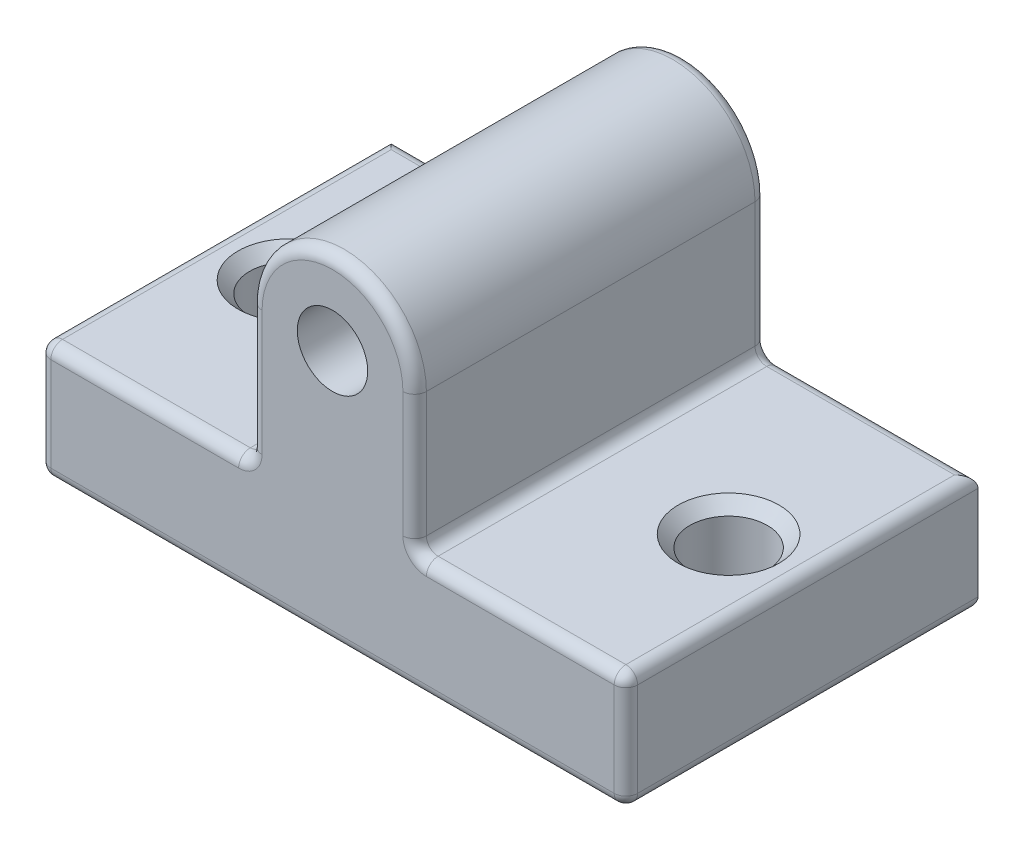
ISO-10303-21;
HEADER;
FILE_DESCRIPTION(('STEP AP214'),'2;1');
FILE_NAME('part.step','',(''),(''),'','','');
FILE_SCHEMA(('AUTOMOTIVE_DESIGN { 1 0 10303 214 1 1 1 1 }'));
ENDSEC;
DATA;
#1=APPLICATION_CONTEXT('core data for automotive mechanical design processes');
#2=APPLICATION_PROTOCOL_DEFINITION('international standard','automotive_design',2000,#1);
#3=PRODUCT_CONTEXT('',#1,'mechanical');
#4=PRODUCT('Part','Part','',(#3));
#5=PRODUCT_RELATED_PRODUCT_CATEGORY('part','',(#4));
#6=PRODUCT_DEFINITION_FORMATION('','',#4);
#7=PRODUCT_DEFINITION_CONTEXT('part definition',#1,'design');
#8=PRODUCT_DEFINITION('design','',#6,#7);
#9=PRODUCT_DEFINITION_SHAPE('','',#8);
#10=(LENGTH_UNIT() NAMED_UNIT(*) SI_UNIT(.MILLI.,.METRE.));
#11=(NAMED_UNIT(*) PLANE_ANGLE_UNIT() SI_UNIT($,.RADIAN.));
#12=(NAMED_UNIT(*) SI_UNIT($,.STERADIAN.) SOLID_ANGLE_UNIT());
#13=UNCERTAINTY_MEASURE_WITH_UNIT(LENGTH_MEASURE(1.E-05),#10,'distance_accuracy_value','');
#14=(GEOMETRIC_REPRESENTATION_CONTEXT(3) GLOBAL_UNCERTAINTY_ASSIGNED_CONTEXT((#13)) GLOBAL_UNIT_ASSIGNED_CONTEXT((#10,
#11,#12)) REPRESENTATION_CONTEXT('',''));
#15=CARTESIAN_POINT('',(0.,0.,0.));
#16=DIRECTION('',(0.,0.,1.));
#17=DIRECTION('',(1.,0.,0.));
#18=AXIS2_PLACEMENT_3D('',#15,#16,#17);
#19=CARTESIAN_POINT('',(25.,5.,30.));
#20=DIRECTION('',(0.,-1.,0.));
#21=DIRECTION('',(1.,0.,0.));
#22=AXIS2_PLACEMENT_3D('',#19,#20,#21);
#23=PLANE('',#22);
#24=CARTESIAN_POINT('',(-18.75,5.,15.));
#25=DIRECTION('',(0.,-1.,0.));
#26=DIRECTION('',(1.,0.,0.));
#27=AXIS2_PLACEMENT_3D('',#24,#25,#26);
#28=CIRCLE('',#27,4.3);
#29=CARTESIAN_POINT('',(-14.45,5.,15.));
#30=VERTEX_POINT('',#29);
#31=EDGE_CURVE('E403',#30,#30,#28,.T.);
#32=ORIENTED_EDGE('',*,*,#31,.T.);
#33=EDGE_LOOP('',(#32));
#34=FACE_BOUND('',#33,.T.);
#35=DIRECTION('',(-1.,0.,0.));
#36=VECTOR('',#35,1.);
#37=CARTESIAN_POINT('',(25.,5.,1.));
#38=LINE('',#37,#36);
#39=CARTESIAN_POINT('',(-8.,5.,1.));
#40=VERTEX_POINT('',#39);
#41=CARTESIAN_POINT('',(-24.,5.,1.));
#42=VERTEX_POINT('',#41);
#43=EDGE_CURVE('E57',#40,#42,#38,.T.);
#44=ORIENTED_EDGE('',*,*,#43,.T.);
#45=DIRECTION('',(0.,0.,-1.));
#46=VECTOR('',#45,1.);
#47=CARTESIAN_POINT('',(-24.,5.,30.));
#48=LINE('',#47,#46);
#49=CARTESIAN_POINT('',(-24.,5.,29.));
#50=VERTEX_POINT('',#49);
#51=EDGE_CURVE('E217',#42,#50,#48,.F.);
#52=ORIENTED_EDGE('',*,*,#51,.T.);
#53=DIRECTION('',(-1.,0.,0.));
#54=VECTOR('',#53,1.);
#55=CARTESIAN_POINT('',(-7.,5.,29.));
#56=LINE('',#55,#54);
#57=CARTESIAN_POINT('',(-8.,5.,29.));
#58=VERTEX_POINT('',#57);
#59=EDGE_CURVE('E309',#50,#58,#56,.F.);
#60=ORIENTED_EDGE('',*,*,#59,.T.);
#61=DIRECTION('',(0.,0.,1.));
#62=VECTOR('',#61,1.);
#63=CARTESIAN_POINT('',(-8.,5.,30.));
#64=LINE('',#63,#62);
#65=EDGE_CURVE('E62',#58,#40,#64,.F.);
#66=ORIENTED_EDGE('',*,*,#65,.T.);
#67=EDGE_LOOP('',(#44,#52,#60,#66));
#68=FACE_BOUND('',#67,.T.);
#69=ADVANCED_FACE('F41',(#34,#68),#23,.F.);
#70=CARTESIAN_POINT('',(-25.,-5.,30.));
#71=DIRECTION('',(1.,0.,0.));
#72=DIRECTION('',(0.,0.,-1.));
#73=AXIS2_PLACEMENT_3D('',#70,#71,#72);
#74=PLANE('',#73);
#75=DIRECTION('',(0.,-1.,0.));
#76=VECTOR('',#75,1.);
#77=CARTESIAN_POINT('',(-25.,-5.,0.));
#78=LINE('',#77,#76);
#79=CARTESIAN_POINT('',(-25.,4.,0.));
#80=VERTEX_POINT('',#79);
#81=CARTESIAN_POINT('',(-25.,-4.,0.));
#82=VERTEX_POINT('',#81);
#83=EDGE_CURVE('E193',#80,#82,#78,.T.);
#84=ORIENTED_EDGE('',*,*,#83,.T.);
#85=DIRECTION('',(0.,0.,-1.));
#86=VECTOR('',#85,1.);
#87=CARTESIAN_POINT('',(-25.,-4.,30.));
#88=LINE('',#87,#86);
#89=CARTESIAN_POINT('',(-25.,-4.,29.));
#90=VERTEX_POINT('',#89);
#91=EDGE_CURVE('E289',#82,#90,#88,.F.);
#92=ORIENTED_EDGE('',*,*,#91,.T.);
#93=DIRECTION('',(0.,-1.,0.));
#94=VECTOR('',#93,1.);
#95=CARTESIAN_POINT('',(-25.,5.,29.));
#96=LINE('',#95,#94);
#97=CARTESIAN_POINT('',(-25.,4.,29.));
#98=VERTEX_POINT('',#97);
#99=EDGE_CURVE('E196',#90,#98,#96,.F.);
#100=ORIENTED_EDGE('',*,*,#99,.T.);
#101=DIRECTION('',(0.,0.,-1.));
#102=VECTOR('',#101,1.);
#103=CARTESIAN_POINT('',(-25.,4.,30.));
#104=LINE('',#103,#102);
#105=EDGE_CURVE('E190',#98,#80,#104,.T.);
#106=ORIENTED_EDGE('',*,*,#105,.T.);
#107=EDGE_LOOP('',(#84,#92,#100,#106));
#108=FACE_BOUND('',#107,.T.);
#109=ADVANCED_FACE('F192',(#108),#74,.F.);
#110=CARTESIAN_POINT('',(25.,-5.,30.));
#111=DIRECTION('',(0.,1.,0.));
#112=DIRECTION('',(-1.,0.,0.));
#113=AXIS2_PLACEMENT_3D('',#110,#111,#112);
#114=PLANE('',#113);
#115=DIRECTION('',(0.,0.,-1.));
#116=VECTOR('',#115,1.);
#117=CARTESIAN_POINT('',(-24.,-5.,30.));
#118=LINE('',#117,#116);
#119=CARTESIAN_POINT('',(-24.,-5.,29.));
#120=VERTEX_POINT('',#119);
#121=CARTESIAN_POINT('',(-24.,-5.,1.));
#122=VERTEX_POINT('',#121);
#123=EDGE_CURVE('E295',#120,#122,#118,.T.);
#124=ORIENTED_EDGE('',*,*,#123,.T.);
#125=DIRECTION('',(1.,0.,0.));
#126=VECTOR('',#125,1.);
#127=CARTESIAN_POINT('',(25.,-5.,1.));
#128=LINE('',#127,#126);
#129=CARTESIAN_POINT('',(24.,-5.,1.));
#130=VERTEX_POINT('',#129);
#131=EDGE_CURVE('E298',#122,#130,#128,.T.);
#132=ORIENTED_EDGE('',*,*,#131,.T.);
#133=DIRECTION('',(0.,0.,-1.));
#134=VECTOR('',#133,1.);
#135=CARTESIAN_POINT('',(24.,-5.,30.));
#136=LINE('',#135,#134);
#137=CARTESIAN_POINT('',(24.,-5.,29.));
#138=VERTEX_POINT('',#137);
#139=EDGE_CURVE('E293',#130,#138,#136,.F.);
#140=ORIENTED_EDGE('',*,*,#139,.T.);
#141=DIRECTION('',(1.,0.,0.));
#142=VECTOR('',#141,1.);
#143=CARTESIAN_POINT('',(-25.,-5.,29.));
#144=LINE('',#143,#142);
#145=EDGE_CURVE('E291',#138,#120,#144,.F.);
#146=ORIENTED_EDGE('',*,*,#145,.T.);
#147=EDGE_LOOP('',(#124,#132,#140,#146));
#148=FACE_BOUND('',#147,.T.);
#149=CARTESIAN_POINT('',(-18.75,-5.,15.));
#150=DIRECTION('',(0.,1.,0.));
#151=DIRECTION('',(-1.,0.,0.));
#152=AXIS2_PLACEMENT_3D('',#149,#150,#151);
#153=CIRCLE('',#152,3.3);
#154=CARTESIAN_POINT('',(-22.05,-5.,15.));
#155=VERTEX_POINT('',#154);
#156=EDGE_CURVE('E528',#155,#155,#153,.F.);
#157=ORIENTED_EDGE('',*,*,#156,.F.);
#158=EDGE_LOOP('',(#157));
#159=FACE_BOUND('',#158,.T.);
#160=CARTESIAN_POINT('',(18.75,-5.,15.));
#161=DIRECTION('',(0.,1.,0.));
#162=DIRECTION('',(-1.,0.,0.));
#163=AXIS2_PLACEMENT_3D('',#160,#161,#162);
#164=CIRCLE('',#163,3.3);
#165=CARTESIAN_POINT('',(15.45,-5.,15.));
#166=VERTEX_POINT('',#165);
#167=EDGE_CURVE('E400',#166,#166,#164,.F.);
#168=ORIENTED_EDGE('',*,*,#167,.F.);
#169=EDGE_LOOP('',(#168));
#170=FACE_BOUND('',#169,.T.);
#171=ADVANCED_FACE('F429',(#148,#159,#170),#114,.F.);
#172=CARTESIAN_POINT('',(25.,-5.,30.));
#173=DIRECTION('',(-1.,0.,0.));
#174=DIRECTION('',(0.,0.,1.));
#175=AXIS2_PLACEMENT_3D('',#172,#173,#174);
#176=PLANE('',#175);
#177=DIRECTION('',(0.,1.,0.));
#178=VECTOR('',#177,1.);
#179=CARTESIAN_POINT('',(25.,-5.,29.));
#180=LINE('',#179,#178);
#181=CARTESIAN_POINT('',(25.,4.,29.));
#182=VERTEX_POINT('',#181);
#183=CARTESIAN_POINT('',(25.,-4.,29.));
#184=VERTEX_POINT('',#183);
#185=EDGE_CURVE('E285',#182,#184,#180,.F.);
#186=ORIENTED_EDGE('',*,*,#185,.T.);
#187=DIRECTION('',(0.,0.,-1.));
#188=VECTOR('',#187,1.);
#189=CARTESIAN_POINT('',(25.,-4.,30.));
#190=LINE('',#189,#188);
#191=CARTESIAN_POINT('',(25.,-4.,0.));
#192=VERTEX_POINT('',#191);
#193=EDGE_CURVE('E200',#184,#192,#190,.T.);
#194=ORIENTED_EDGE('',*,*,#193,.T.);
#195=DIRECTION('',(0.,1.,0.));
#196=VECTOR('',#195,1.);
#197=CARTESIAN_POINT('',(25.,-5.,0.));
#198=LINE('',#197,#196);
#199=CARTESIAN_POINT('',(25.,4.,0.));
#200=VERTEX_POINT('',#199);
#201=EDGE_CURVE('E211',#192,#200,#198,.T.);
#202=ORIENTED_EDGE('',*,*,#201,.T.);
#203=DIRECTION('',(0.,0.,-1.));
#204=VECTOR('',#203,1.);
#205=CARTESIAN_POINT('',(25.,4.,30.));
#206=LINE('',#205,#204);
#207=EDGE_CURVE('E283',#200,#182,#206,.F.);
#208=ORIENTED_EDGE('',*,*,#207,.T.);
#209=EDGE_LOOP('',(#186,#194,#202,#208));
#210=FACE_BOUND('',#209,.T.);
#211=ADVANCED_FACE('F434',(#210),#176,.F.);
#212=CARTESIAN_POINT('',(18.75,5.,15.));
#213=DIRECTION('',(0.,-1.,0.));
#214=DIRECTION('',(1.,0.,0.));
#215=AXIS2_PLACEMENT_3D('',#212,#213,#214);
#216=CIRCLE('',#215,4.3);
#217=CARTESIAN_POINT('',(23.05,5.,15.));
#218=VERTEX_POINT('',#217);
#219=EDGE_CURVE('E11',#218,#218,#216,.T.);
#220=ORIENTED_EDGE('',*,*,#219,.T.);
#221=EDGE_LOOP('',(#220));
#222=FACE_BOUND('',#221,.T.);
#223=DIRECTION('',(0.,0.,-1.));
#224=VECTOR('',#223,1.);
#225=CARTESIAN_POINT('',(24.,5.,30.));
#226=LINE('',#225,#224);
#227=CARTESIAN_POINT('',(24.,5.,29.));
#228=VERTEX_POINT('',#227);
#229=CARTESIAN_POINT('',(24.,5.,1.));
#230=VERTEX_POINT('',#229);
#231=EDGE_CURVE('E304',#228,#230,#226,.T.);
#232=ORIENTED_EDGE('',*,*,#231,.T.);
#233=DIRECTION('',(-1.,0.,0.));
#234=VECTOR('',#233,1.);
#235=CARTESIAN_POINT('',(25.,5.,1.));
#236=LINE('',#235,#234);
#237=CARTESIAN_POINT('',(8.,5.,1.));
#238=VERTEX_POINT('',#237);
#239=EDGE_CURVE('E307',#230,#238,#236,.T.);
#240=ORIENTED_EDGE('',*,*,#239,.T.);
#241=DIRECTION('',(0.,0.,1.));
#242=VECTOR('',#241,1.);
#243=CARTESIAN_POINT('',(8.,5.,30.));
#244=LINE('',#243,#242);
#245=CARTESIAN_POINT('',(8.,5.,29.));
#246=VERTEX_POINT('',#245);
#247=EDGE_CURVE('E302',#238,#246,#244,.T.);
#248=ORIENTED_EDGE('',*,*,#247,.T.);
#249=DIRECTION('',(-1.,0.,0.));
#250=VECTOR('',#249,1.);
#251=CARTESIAN_POINT('',(25.,5.,29.));
#252=LINE('',#251,#250);
#253=EDGE_CURVE('E300',#246,#228,#252,.F.);
#254=ORIENTED_EDGE('',*,*,#253,.T.);
#255=EDGE_LOOP('',(#232,#240,#248,#254));
#256=FACE_BOUND('',#255,.T.);
#257=ADVANCED_FACE('F423',(#222,#256),#23,.F.);
#258=CARTESIAN_POINT('',(0.,0.,30.));
#259=DIRECTION('',(0.,0.,1.));
#260=DIRECTION('',(1.,0.,0.));
#261=AXIS2_PLACEMENT_3D('',#258,#259,#260);
#262=PLANE('',#261);
#263=DIRECTION('',(-1.,0.,0.));
#264=VECTOR('',#263,1.);
#265=CARTESIAN_POINT('',(-25.,4.,30.));
#266=LINE('',#265,#264);
#267=CARTESIAN_POINT('',(-8.,4.,30.));
#268=VERTEX_POINT('',#267);
#269=CARTESIAN_POINT('',(-24.,4.,30.));
#270=VERTEX_POINT('',#269);
#271=EDGE_CURVE('E277',#268,#270,#266,.T.);
#272=ORIENTED_EDGE('',*,*,#271,.T.);
#273=DIRECTION('',(0.,-1.,0.));
#274=VECTOR('',#273,1.);
#275=CARTESIAN_POINT('',(-24.,-5.,30.));
#276=LINE('',#275,#274);
#277=CARTESIAN_POINT('',(-24.,-4.,30.));
#278=VERTEX_POINT('',#277);
#279=EDGE_CURVE('E281',#270,#278,#276,.T.);
#280=ORIENTED_EDGE('',*,*,#279,.T.);
#281=DIRECTION('',(1.,0.,0.));
#282=VECTOR('',#281,1.);
#283=CARTESIAN_POINT('',(25.,-4.,30.));
#284=LINE('',#283,#282);
#285=CARTESIAN_POINT('',(24.,-4.,30.));
#286=VERTEX_POINT('',#285);
#287=EDGE_CURVE('E279',#278,#286,#284,.T.);
#288=ORIENTED_EDGE('',*,*,#287,.T.);
#289=DIRECTION('',(0.,1.,0.));
#290=VECTOR('',#289,1.);
#291=CARTESIAN_POINT('',(24.,5.,30.));
#292=LINE('',#291,#290);
#293=CARTESIAN_POINT('',(24.,4.,30.));
#294=VERTEX_POINT('',#293);
#295=EDGE_CURVE('E273',#286,#294,#292,.T.);
#296=ORIENTED_EDGE('',*,*,#295,.T.);
#297=DIRECTION('',(-1.,0.,0.));
#298=VECTOR('',#297,1.);
#299=CARTESIAN_POINT('',(7.,4.,30.));
#300=LINE('',#299,#298);
#301=CARTESIAN_POINT('',(8.,4.,30.));
#302=VERTEX_POINT('',#301);
#303=EDGE_CURVE('E271',#294,#302,#300,.T.);
#304=ORIENTED_EDGE('',*,*,#303,.T.);
#305=CARTESIAN_POINT('',(8.,6.,30.));
#306=DIRECTION('',(0.,0.,1.));
#307=DIRECTION('',(1.,0.,0.));
#308=AXIS2_PLACEMENT_3D('',#305,#306,#307);
#309=CIRCLE('',#308,2.);
#310=CARTESIAN_POINT('',(6.,6.,30.));
#311=VERTEX_POINT('',#310);
#312=EDGE_CURVE('E268',#311,#302,#309,.T.);
#313=ORIENTED_EDGE('',*,*,#312,.F.);
#314=DIRECTION('',(0.,1.,0.));
#315=VECTOR('',#314,1.);
#316=CARTESIAN_POINT('',(6.,0.,30.));
#317=LINE('',#316,#315);
#318=CARTESIAN_POINT('',(6.,16.65178901,30.));
#319=VERTEX_POINT('',#318);
#320=EDGE_CURVE('E263',#311,#319,#317,.T.);
#321=ORIENTED_EDGE('',*,*,#320,.T.);
#322=CARTESIAN_POINT('',(0.,16.65178901,30.));
#323=DIRECTION('',(0.,0.,1.));
#324=DIRECTION('',(1.,0.,0.));
#325=AXIS2_PLACEMENT_3D('',#322,#323,#324);
#326=CIRCLE('',#325,6.);
#327=CARTESIAN_POINT('',(-6.,16.65178901,30.));
#328=VERTEX_POINT('',#327);
#329=EDGE_CURVE('E261',#319,#328,#326,.T.);
#330=ORIENTED_EDGE('',*,*,#329,.T.);
#331=DIRECTION('',(0.,-1.,0.));
#332=VECTOR('',#331,1.);
#333=CARTESIAN_POINT('',(-6.,0.,30.));
#334=LINE('',#333,#332);
#335=CARTESIAN_POINT('',(-6.,6.,30.));
#336=VERTEX_POINT('',#335);
#337=EDGE_CURVE('E265',#328,#336,#334,.T.);
#338=ORIENTED_EDGE('',*,*,#337,.T.);
#339=CARTESIAN_POINT('',(-8.,6.,30.));
#340=DIRECTION('',(0.,0.,1.));
#341=DIRECTION('',(1.,0.,0.));
#342=AXIS2_PLACEMENT_3D('',#339,#340,#341);
#343=CIRCLE('',#342,2.);
#344=EDGE_CURVE('E275',#268,#336,#343,.T.);
#345=ORIENTED_EDGE('',*,*,#344,.F.);
#346=EDGE_LOOP('',(#272,#280,#288,#296,#304,#313,#321,#330,#338,#345));
#347=FACE_BOUND('',#346,.T.);
#348=CARTESIAN_POINT('',(0.,16.65178901,30.));
#349=DIRECTION('',(0.,0.,1.));
#350=DIRECTION('',(1.,0.,0.));
#351=AXIS2_PLACEMENT_3D('',#348,#349,#350);
#352=CIRCLE('',#351,3.);
#353=CARTESIAN_POINT('',(3.,16.65178901,30.));
#354=VERTEX_POINT('',#353);
#355=EDGE_CURVE('E523',#354,#354,#352,.T.);
#356=ORIENTED_EDGE('',*,*,#355,.F.);
#357=EDGE_LOOP('',(#356));
#358=FACE_BOUND('',#357,.T.);
#359=ADVANCED_FACE('F433',(#347,#358),#262,.T.);
#360=CARTESIAN_POINT('',(0.,0.,0.));
#361=DIRECTION('',(0.,0.,1.));
#362=DIRECTION('',(1.,0.,0.));
#363=AXIS2_PLACEMENT_3D('',#360,#361,#362);
#364=PLANE('',#363);
#365=ORIENTED_EDGE('',*,*,#201,.F.);
#366=DIRECTION('',(1.,0.,0.));
#367=VECTOR('',#366,1.);
#368=CARTESIAN_POINT('',(0.,-4.,0.));
#369=LINE('',#368,#367);
#370=EDGE_CURVE('E210',#192,#82,#369,.F.);
#371=ORIENTED_EDGE('',*,*,#370,.T.);
#372=ORIENTED_EDGE('',*,*,#83,.F.);
#373=DIRECTION('',(-1.,0.,0.));
#374=VECTOR('',#373,1.);
#375=CARTESIAN_POINT('',(0.,4.,0.));
#376=LINE('',#375,#374);
#377=CARTESIAN_POINT('',(-8.,4.,0.));
#378=VERTEX_POINT('',#377);
#379=EDGE_CURVE('E207',#80,#378,#376,.F.);
#380=ORIENTED_EDGE('',*,*,#379,.T.);
#381=CARTESIAN_POINT('',(-8.,6.,0.));
#382=DIRECTION('',(0.,0.,1.));
#383=DIRECTION('',(1.,0.,0.));
#384=AXIS2_PLACEMENT_3D('',#381,#382,#383);
#385=CIRCLE('',#384,2.);
#386=CARTESIAN_POINT('',(-6.,6.,0.));
#387=VERTEX_POINT('',#386);
#388=EDGE_CURVE('E227',#387,#378,#385,.F.);
#389=ORIENTED_EDGE('',*,*,#388,.F.);
#390=DIRECTION('',(0.,1.,0.));
#391=VECTOR('',#390,1.);
#392=CARTESIAN_POINT('',(-6.,16.65178901,0.));
#393=LINE('',#392,#391);
#394=CARTESIAN_POINT('',(-6.,16.65178901,0.));
#395=VERTEX_POINT('',#394);
#396=EDGE_CURVE('E226',#387,#395,#393,.T.);
#397=ORIENTED_EDGE('',*,*,#396,.T.);
#398=CARTESIAN_POINT('',(0.,16.65178901,0.));
#399=DIRECTION('',(0.,0.,1.));
#400=DIRECTION('',(1.,0.,0.));
#401=AXIS2_PLACEMENT_3D('',#398,#399,#400);
#402=CIRCLE('',#401,6.);
#403=CARTESIAN_POINT('',(6.,16.65178901,0.));
#404=VERTEX_POINT('',#403);
#405=EDGE_CURVE('E229',#395,#404,#402,.F.);
#406=ORIENTED_EDGE('',*,*,#405,.T.);
#407=DIRECTION('',(0.,-1.,0.));
#408=VECTOR('',#407,1.);
#409=CARTESIAN_POINT('',(6.,5.,0.));
#410=LINE('',#409,#408);
#411=CARTESIAN_POINT('',(6.,6.,0.));
#412=VERTEX_POINT('',#411);
#413=EDGE_CURVE('E236',#404,#412,#410,.T.);
#414=ORIENTED_EDGE('',*,*,#413,.T.);
#415=CARTESIAN_POINT('',(8.,6.,0.));
#416=DIRECTION('',(0.,0.,1.));
#417=DIRECTION('',(1.,0.,0.));
#418=AXIS2_PLACEMENT_3D('',#415,#416,#417);
#419=CIRCLE('',#418,2.);
#420=CARTESIAN_POINT('',(8.,4.,0.));
#421=VERTEX_POINT('',#420);
#422=EDGE_CURVE('E238',#421,#412,#419,.F.);
#423=ORIENTED_EDGE('',*,*,#422,.F.);
#424=DIRECTION('',(-1.,0.,0.));
#425=VECTOR('',#424,1.);
#426=CARTESIAN_POINT('',(0.,4.,0.));
#427=LINE('',#426,#425);
#428=EDGE_CURVE('E241',#421,#200,#427,.F.);
#429=ORIENTED_EDGE('',*,*,#428,.T.);
#430=EDGE_LOOP('',(#365,#371,#372,#380,#389,#397,#406,#414,#423,#429));
#431=FACE_BOUND('',#430,.T.);
#432=CARTESIAN_POINT('',(0.,16.65178901,0.));
#433=DIRECTION('',(0.,0.,1.));
#434=DIRECTION('',(1.,0.,0.));
#435=AXIS2_PLACEMENT_3D('',#432,#433,#434);
#436=CIRCLE('',#435,3.);
#437=CARTESIAN_POINT('',(3.,16.65178901,0.));
#438=VERTEX_POINT('',#437);
#439=EDGE_CURVE('E212',#438,#438,#436,.F.);
#440=ORIENTED_EDGE('',*,*,#439,.F.);
#441=EDGE_LOOP('',(#440));
#442=FACE_BOUND('',#441,.T.);
#443=ADVANCED_FACE('F204',(#431,#442),#364,.F.);
#444=CARTESIAN_POINT('',(7.,16.65178901,-23.3214329163874));
#445=DIRECTION('',(1.,0.,0.));
#446=DIRECTION('',(0.,1.,0.));
#447=AXIS2_PLACEMENT_3D('',#444,#445,#446);
#448=PLANE('',#447);
#449=DIRECTION('',(0.,0.,1.));
#450=VECTOR('',#449,1.);
#451=CARTESIAN_POINT('',(7.,6.,-23.3214329163874));
#452=LINE('',#451,#450);
#453=CARTESIAN_POINT('',(7.,6.,29.));
#454=VERTEX_POINT('',#453);
#455=CARTESIAN_POINT('',(7.,6.,1.));
#456=VERTEX_POINT('',#455);
#457=EDGE_CURVE('E249',#454,#456,#452,.F.);
#458=ORIENTED_EDGE('',*,*,#457,.T.);
#459=DIRECTION('',(0.,-1.,0.));
#460=VECTOR('',#459,1.);
#461=CARTESIAN_POINT('',(7.,16.65178901,1.));
#462=LINE('',#461,#460);
#463=CARTESIAN_POINT('',(7.,16.65178901,1.));
#464=VERTEX_POINT('',#463);
#465=EDGE_CURVE('E253',#456,#464,#462,.F.);
#466=ORIENTED_EDGE('',*,*,#465,.T.);
#467=DIRECTION('',(0.,0.,1.));
#468=VECTOR('',#467,1.);
#469=CARTESIAN_POINT('',(7.,16.65178901,-23.3214329163874));
#470=LINE('',#469,#468);
#471=CARTESIAN_POINT('',(7.,16.65178901,29.));
#472=VERTEX_POINT('',#471);
#473=EDGE_CURVE('E520',#464,#472,#470,.T.);
#474=ORIENTED_EDGE('',*,*,#473,.T.);
#475=DIRECTION('',(0.,1.,0.));
#476=VECTOR('',#475,1.);
#477=CARTESIAN_POINT('',(7.,16.65178901,29.));
#478=LINE('',#477,#476);
#479=EDGE_CURVE('E251',#472,#454,#478,.F.);
#480=ORIENTED_EDGE('',*,*,#479,.T.);
#481=EDGE_LOOP('',(#458,#466,#474,#480));
#482=FACE_BOUND('',#481,.T.);
#483=ADVANCED_FACE('F560',(#482),#448,.T.);
#484=CARTESIAN_POINT('',(0.,16.65178901,-23.3214329163874));
#485=DIRECTION('',(0.,0.,1.));
#486=DIRECTION('',(1.,0.,0.));
#487=AXIS2_PLACEMENT_3D('',#484,#485,#486);
#488=CYLINDRICAL_SURFACE('',#487,7.);
#489=ORIENTED_EDGE('',*,*,#473,.F.);
#490=CARTESIAN_POINT('',(0.,16.65178901,1.));
#491=DIRECTION('',(0.,0.,1.));
#492=DIRECTION('',(1.,0.,0.));
#493=AXIS2_PLACEMENT_3D('',#490,#491,#492);
#494=CIRCLE('',#493,7.);
#495=CARTESIAN_POINT('',(-7.,16.65178901,1.));
#496=VERTEX_POINT('',#495);
#497=EDGE_CURVE('E246',#464,#496,#494,.T.);
#498=ORIENTED_EDGE('',*,*,#497,.T.);
#499=DIRECTION('',(0.,0.,1.));
#500=VECTOR('',#499,1.);
#501=CARTESIAN_POINT('',(-7.,16.65178901,-23.3214329163874));
#502=LINE('',#501,#500);
#503=CARTESIAN_POINT('',(-7.,16.65178901,29.));
#504=VERTEX_POINT('',#503);
#505=EDGE_CURVE('E519',#496,#504,#502,.T.);
#506=ORIENTED_EDGE('',*,*,#505,.T.);
#507=CARTESIAN_POINT('',(0.,16.65178901,29.));
#508=DIRECTION('',(0.,0.,1.));
#509=DIRECTION('',(1.,0.,0.));
#510=AXIS2_PLACEMENT_3D('',#507,#508,#509);
#511=CIRCLE('',#510,7.);
#512=EDGE_CURVE('E244',#504,#472,#511,.F.);
#513=ORIENTED_EDGE('',*,*,#512,.T.);
#514=EDGE_LOOP('',(#489,#498,#506,#513));
#515=FACE_BOUND('',#514,.T.);
#516=ADVANCED_FACE('F556',(#515),#488,.T.);
#517=CARTESIAN_POINT('',(-7.,5.,-23.3214329163874));
#518=DIRECTION('',(-1.,0.,0.));
#519=DIRECTION('',(0.,-1.,0.));
#520=AXIS2_PLACEMENT_3D('',#517,#518,#519);
#521=PLANE('',#520);
#522=ORIENTED_EDGE('',*,*,#505,.F.);
#523=DIRECTION('',(0.,1.,0.));
#524=VECTOR('',#523,1.);
#525=CARTESIAN_POINT('',(-7.,5.,1.));
#526=LINE('',#525,#524);
#527=CARTESIAN_POINT('',(-7.,6.,1.));
#528=VERTEX_POINT('',#527);
#529=EDGE_CURVE('E259',#496,#528,#526,.F.);
#530=ORIENTED_EDGE('',*,*,#529,.T.);
#531=DIRECTION('',(0.,0.,1.));
#532=VECTOR('',#531,1.);
#533=CARTESIAN_POINT('',(-7.,6.,-23.3214329163874));
#534=LINE('',#533,#532);
#535=CARTESIAN_POINT('',(-7.,6.,29.));
#536=VERTEX_POINT('',#535);
#537=EDGE_CURVE('E255',#528,#536,#534,.T.);
#538=ORIENTED_EDGE('',*,*,#537,.T.);
#539=DIRECTION('',(0.,-1.,0.));
#540=VECTOR('',#539,1.);
#541=CARTESIAN_POINT('',(-7.,5.,29.));
#542=LINE('',#541,#540);
#543=EDGE_CURVE('E257',#536,#504,#542,.F.);
#544=ORIENTED_EDGE('',*,*,#543,.T.);
#545=EDGE_LOOP('',(#522,#530,#538,#544));
#546=FACE_BOUND('',#545,.T.);
#547=ADVANCED_FACE('F550',(#546),#521,.T.);
#548=CARTESIAN_POINT('',(0.,16.65178901,-23.3214329163874));
#549=DIRECTION('',(0.,0.,1.));
#550=DIRECTION('',(1.,0.,0.));
#551=AXIS2_PLACEMENT_3D('',#548,#549,#550);
#552=CYLINDRICAL_SURFACE('',#551,3.);
#553=ORIENTED_EDGE('',*,*,#439,.T.);
#554=EDGE_LOOP('',(#553));
#555=FACE_BOUND('',#554,.T.);
#556=ORIENTED_EDGE('',*,*,#355,.T.);
#557=EDGE_LOOP('',(#556));
#558=FACE_BOUND('',#557,.T.);
#559=ADVANCED_FACE('F541',(#555,#558),#552,.F.);
#560=CARTESIAN_POINT('',(18.75,-5.001,15.));
#561=DIRECTION('',(0.,1.,0.));
#562=DIRECTION('',(-1.,0.,0.));
#563=AXIS2_PLACEMENT_3D('',#560,#561,#562);
#564=CYLINDRICAL_SURFACE('',#563,3.3);
#565=CARTESIAN_POINT('',(18.75,4.00000000000001,15.));
#566=DIRECTION('',(0.,-1.,0.));
#567=DIRECTION('',(0.,0.,-1.));
#568=AXIS2_PLACEMENT_3D('',#565,#566,#567);
#569=CIRCLE('',#568,3.3);
#570=CARTESIAN_POINT('',(18.75,4.00000000000001,11.7));
#571=VERTEX_POINT('',#570);
#572=EDGE_CURVE('E50',#571,#571,#569,.F.);
#573=ORIENTED_EDGE('',*,*,#572,.T.);
#574=EDGE_LOOP('',(#573));
#575=FACE_BOUND('',#574,.T.);
#576=ORIENTED_EDGE('',*,*,#167,.T.);
#577=EDGE_LOOP('',(#576));
#578=FACE_BOUND('',#577,.T.);
#579=ADVANCED_FACE('F408',(#575,#578),#564,.F.);
#580=CARTESIAN_POINT('',(-18.75,-5.00100000000001,15.));
#581=DIRECTION('',(0.,1.,0.));
#582=DIRECTION('',(-1.,0.,0.));
#583=AXIS2_PLACEMENT_3D('',#580,#581,#582);
#584=CYLINDRICAL_SURFACE('',#583,3.3);
#585=CARTESIAN_POINT('',(-18.75,4.,15.));
#586=DIRECTION('',(0.,-1.,0.));
#587=DIRECTION('',(0.,0.,-1.));
#588=AXIS2_PLACEMENT_3D('',#585,#586,#587);
#589=CIRCLE('',#588,3.3);
#590=CARTESIAN_POINT('',(-18.75,4.,11.7));
#591=VERTEX_POINT('',#590);
#592=EDGE_CURVE('E314',#591,#591,#589,.F.);
#593=ORIENTED_EDGE('',*,*,#592,.T.);
#594=EDGE_LOOP('',(#593));
#595=FACE_BOUND('',#594,.T.);
#596=ORIENTED_EDGE('',*,*,#156,.T.);
#597=EDGE_LOOP('',(#596));
#598=FACE_BOUND('',#597,.T.);
#599=ADVANCED_FACE('F534',(#595,#598),#584,.F.);
#600=CARTESIAN_POINT('',(25.,-4.,1.));
#601=DIRECTION('',(1.,0.,0.));
#602=DIRECTION('',(0.,1.,0.));
#603=AXIS2_PLACEMENT_3D('',#600,#601,#602);
#604=CYLINDRICAL_SURFACE('',#603,1.);
#605=CARTESIAN_POINT('',(24.,-4.,1.));
#606=DIRECTION('',(0.707106781186547,0.,0.707106781186547));
#607=DIRECTION('',(0.707106781186547,0.,-0.707106781186547));
#608=AXIS2_PLACEMENT_3D('',#605,#606,#607);
#609=ELLIPSE('',#608,1.41421356237309,1.);
#610=EDGE_CURVE('E395',#130,#192,#609,.T.);
#611=ORIENTED_EDGE('',*,*,#610,.F.);
#612=ORIENTED_EDGE('',*,*,#131,.F.);
#613=CARTESIAN_POINT('',(-24.,-4.,1.));
#614=DIRECTION('',(0.707106781186547,0.,-0.707106781186547));
#615=DIRECTION('',(0.707106781186547,0.,0.707106781186547));
#616=AXIS2_PLACEMENT_3D('',#613,#614,#615);
#617=ELLIPSE('',#616,1.41421356237309,1.);
#618=EDGE_CURVE('E398',#82,#122,#617,.F.);
#619=ORIENTED_EDGE('',*,*,#618,.F.);
#620=ORIENTED_EDGE('',*,*,#370,.F.);
#621=EDGE_LOOP('',(#611,#612,#619,#620));
#622=FACE_BOUND('',#621,.T.);
#623=ADVANCED_FACE('F546',(#622),#604,.T.);
#624=CARTESIAN_POINT('',(-24.,-4.,30.));
#625=DIRECTION('',(0.,0.,-1.));
#626=DIRECTION('',(-1.,0.,0.));
#627=AXIS2_PLACEMENT_3D('',#624,#625,#626);
#628=CYLINDRICAL_SURFACE('',#627,1.);
#629=ORIENTED_EDGE('',*,*,#618,.T.);
#630=ORIENTED_EDGE('',*,*,#123,.F.);
#631=CARTESIAN_POINT('',(-24.,-4.,29.));
#632=DIRECTION('',(0.,0.,1.));
#633=DIRECTION('',(1.,0.,0.));
#634=AXIS2_PLACEMENT_3D('',#631,#632,#633);
#635=CIRCLE('',#634,1.);
#636=EDGE_CURVE('E389',#90,#120,#635,.T.);
#637=ORIENTED_EDGE('',*,*,#636,.F.);
#638=ORIENTED_EDGE('',*,*,#91,.F.);
#639=EDGE_LOOP('',(#629,#630,#637,#638));
#640=FACE_BOUND('',#639,.T.);
#641=ADVANCED_FACE('F592',(#640),#628,.T.);
#642=CARTESIAN_POINT('',(24.,-4.,30.));
#643=DIRECTION('',(0.,0.,-1.));
#644=DIRECTION('',(-1.,0.,0.));
#645=AXIS2_PLACEMENT_3D('',#642,#643,#644);
#646=CYLINDRICAL_SURFACE('',#645,1.);
#647=ORIENTED_EDGE('',*,*,#610,.T.);
#648=ORIENTED_EDGE('',*,*,#193,.F.);
#649=CARTESIAN_POINT('',(24.,-4.,29.));
#650=DIRECTION('',(0.,0.,1.));
#651=DIRECTION('',(1.,0.,0.));
#652=AXIS2_PLACEMENT_3D('',#649,#650,#651);
#653=CIRCLE('',#652,1.);
#654=EDGE_CURVE('E386',#138,#184,#653,.T.);
#655=ORIENTED_EDGE('',*,*,#654,.F.);
#656=ORIENTED_EDGE('',*,*,#139,.F.);
#657=EDGE_LOOP('',(#647,#648,#655,#656));
#658=FACE_BOUND('',#657,.T.);
#659=ADVANCED_FACE('F602',(#658),#646,.T.);
#660=CARTESIAN_POINT('',(0.,-4.,29.));
#661=DIRECTION('',(-1.,0.,0.));
#662=DIRECTION('',(0.,-1.,0.));
#663=AXIS2_PLACEMENT_3D('',#660,#661,#662);
#664=CYLINDRICAL_SURFACE('',#663,1.);
#665=CARTESIAN_POINT('',(-24.,-4.,29.));
#666=DIRECTION('',(-1.,0.,0.));
#667=DIRECTION('',(0.,0.,1.));
#668=AXIS2_PLACEMENT_3D('',#665,#666,#667);
#669=CIRCLE('',#668,1.);
#670=EDGE_CURVE('E392',#120,#278,#669,.T.);
#671=ORIENTED_EDGE('',*,*,#670,.F.);
#672=ORIENTED_EDGE('',*,*,#145,.F.);
#673=CARTESIAN_POINT('',(24.,-4.,29.));
#674=DIRECTION('',(1.,0.,0.));
#675=DIRECTION('',(0.,0.,-1.));
#676=AXIS2_PLACEMENT_3D('',#673,#674,#675);
#677=CIRCLE('',#676,1.);
#678=EDGE_CURVE('E383',#286,#138,#677,.T.);
#679=ORIENTED_EDGE('',*,*,#678,.F.);
#680=ORIENTED_EDGE('',*,*,#287,.F.);
#681=EDGE_LOOP('',(#671,#672,#679,#680));
#682=FACE_BOUND('',#681,.T.);
#683=ADVANCED_FACE('F611',(#682),#664,.T.);
#684=CARTESIAN_POINT('',(-24.,-4.,29.));
#685=DIRECTION('',(0.,-1.,0.));
#686=DIRECTION('',(0.,0.,-1.));
#687=AXIS2_PLACEMENT_3D('',#684,#685,#686);
#688=SPHERICAL_SURFACE('',#687,1.);
#689=ORIENTED_EDGE('',*,*,#636,.T.);
#690=ORIENTED_EDGE('',*,*,#670,.T.);
#691=CARTESIAN_POINT('',(-24.,-4.,29.));
#692=DIRECTION('',(0.,-1.,0.));
#693=DIRECTION('',(0.,0.,-1.));
#694=AXIS2_PLACEMENT_3D('',#691,#692,#693);
#695=CIRCLE('',#694,1.);
#696=EDGE_CURVE('E380',#90,#278,#695,.F.);
#697=ORIENTED_EDGE('',*,*,#696,.F.);
#698=EDGE_LOOP('',(#689,#690,#697));
#699=FACE_BOUND('',#698,.T.);
#700=ADVANCED_FACE('F620',(#699),#688,.T.);
#701=CARTESIAN_POINT('',(24.,-4.,29.));
#702=DIRECTION('',(0.,-1.,0.));
#703=DIRECTION('',(0.,0.,-1.));
#704=AXIS2_PLACEMENT_3D('',#701,#702,#703);
#705=SPHERICAL_SURFACE('',#704,1.);
#706=ORIENTED_EDGE('',*,*,#678,.T.);
#707=ORIENTED_EDGE('',*,*,#654,.T.);
#708=CARTESIAN_POINT('',(24.,-4.,29.));
#709=DIRECTION('',(0.,-1.,0.));
#710=DIRECTION('',(0.,0.,-1.));
#711=AXIS2_PLACEMENT_3D('',#708,#709,#710);
#712=CIRCLE('',#711,1.);
#713=EDGE_CURVE('E377',#286,#184,#712,.F.);
#714=ORIENTED_EDGE('',*,*,#713,.F.);
#715=EDGE_LOOP('',(#706,#707,#714));
#716=FACE_BOUND('',#715,.T.);
#717=ADVANCED_FACE('F629',(#716),#705,.T.);
#718=CARTESIAN_POINT('',(-24.,0.,29.));
#719=DIRECTION('',(0.,1.,0.));
#720=DIRECTION('',(0.,0.,1.));
#721=AXIS2_PLACEMENT_3D('',#718,#719,#720);
#722=CYLINDRICAL_SURFACE('',#721,1.);
#723=ORIENTED_EDGE('',*,*,#696,.T.);
#724=ORIENTED_EDGE('',*,*,#279,.F.);
#725=CARTESIAN_POINT('',(-24.,4.,29.));
#726=DIRECTION('',(0.,1.,0.));
#727=DIRECTION('',(0.,0.,1.));
#728=AXIS2_PLACEMENT_3D('',#725,#726,#727);
#729=CIRCLE('',#728,1.);
#730=EDGE_CURVE('E368',#98,#270,#729,.T.);
#731=ORIENTED_EDGE('',*,*,#730,.F.);
#732=ORIENTED_EDGE('',*,*,#99,.F.);
#733=EDGE_LOOP('',(#723,#724,#731,#732));
#734=FACE_BOUND('',#733,.T.);
#735=ADVANCED_FACE('F638',(#734),#722,.T.);
#736=CARTESIAN_POINT('',(24.,0.,29.));
#737=DIRECTION('',(0.,-1.,0.));
#738=DIRECTION('',(0.,0.,-1.));
#739=AXIS2_PLACEMENT_3D('',#736,#737,#738);
#740=CYLINDRICAL_SURFACE('',#739,1.);
#741=ORIENTED_EDGE('',*,*,#713,.T.);
#742=ORIENTED_EDGE('',*,*,#185,.F.);
#743=CARTESIAN_POINT('',(24.,4.,29.));
#744=DIRECTION('',(0.,1.,0.));
#745=DIRECTION('',(0.,0.,1.));
#746=AXIS2_PLACEMENT_3D('',#743,#744,#745);
#747=CIRCLE('',#746,1.);
#748=EDGE_CURVE('E365',#294,#182,#747,.T.);
#749=ORIENTED_EDGE('',*,*,#748,.F.);
#750=ORIENTED_EDGE('',*,*,#295,.F.);
#751=EDGE_LOOP('',(#741,#742,#749,#750));
#752=FACE_BOUND('',#751,.T.);
#753=ADVANCED_FACE('F647',(#752),#740,.T.);
#754=CARTESIAN_POINT('',(0.,16.65178901,29.));
#755=DIRECTION('',(0.,0.,1.));
#756=DIRECTION('',(1.,0.,0.));
#757=AXIS2_PLACEMENT_3D('',#754,#755,#756);
#758=TOROIDAL_SURFACE('',#757,6.,1.);
#759=CARTESIAN_POINT('',(6.,16.65178901,29.));
#760=DIRECTION('',(0.,-1.,0.));
#761=DIRECTION('',(0.,0.,-1.));
#762=AXIS2_PLACEMENT_3D('',#759,#760,#761);
#763=CIRCLE('',#762,1.);
#764=EDGE_CURVE('E359',#472,#319,#763,.T.);
#765=ORIENTED_EDGE('',*,*,#764,.F.);
#766=ORIENTED_EDGE('',*,*,#512,.F.);
#767=CARTESIAN_POINT('',(-6.,16.65178901,29.));
#768=DIRECTION('',(0.,-1.,0.));
#769=DIRECTION('',(0.,0.,-1.));
#770=AXIS2_PLACEMENT_3D('',#767,#768,#769);
#771=CIRCLE('',#770,1.);
#772=EDGE_CURVE('E374',#328,#504,#771,.T.);
#773=ORIENTED_EDGE('',*,*,#772,.F.);
#774=ORIENTED_EDGE('',*,*,#329,.F.);
#775=EDGE_LOOP('',(#765,#766,#773,#774));
#776=FACE_BOUND('',#775,.T.);
#777=ADVANCED_FACE('F483',(#776),#758,.T.);
#778=CARTESIAN_POINT('',(-6.,0.,29.));
#779=DIRECTION('',(0.,-1.,0.));
#780=DIRECTION('',(1.,0.,0.));
#781=AXIS2_PLACEMENT_3D('',#778,#779,#780);
#782=CYLINDRICAL_SURFACE('',#781,1.);
#783=ORIENTED_EDGE('',*,*,#772,.T.);
#784=ORIENTED_EDGE('',*,*,#543,.F.);
#785=CARTESIAN_POINT('',(-6.,6.,29.));
#786=DIRECTION('',(0.,-1.,0.));
#787=DIRECTION('',(0.,0.,-1.));
#788=AXIS2_PLACEMENT_3D('',#785,#786,#787);
#789=CIRCLE('',#788,1.);
#790=EDGE_CURVE('E356',#336,#536,#789,.T.);
#791=ORIENTED_EDGE('',*,*,#790,.F.);
#792=ORIENTED_EDGE('',*,*,#337,.F.);
#793=EDGE_LOOP('',(#783,#784,#791,#792));
#794=FACE_BOUND('',#793,.T.);
#795=ADVANCED_FACE('F489',(#794),#782,.T.);
#796=CARTESIAN_POINT('',(0.,4.,29.));
#797=DIRECTION('',(1.,0.,0.));
#798=DIRECTION('',(0.,1.,0.));
#799=AXIS2_PLACEMENT_3D('',#796,#797,#798);
#800=CYLINDRICAL_SURFACE('',#799,1.);
#801=CARTESIAN_POINT('',(-24.,4.,29.));
#802=DIRECTION('',(-1.,0.,0.));
#803=DIRECTION('',(0.,0.,1.));
#804=AXIS2_PLACEMENT_3D('',#801,#802,#803);
#805=CIRCLE('',#804,1.);
#806=EDGE_CURVE('E371',#270,#50,#805,.T.);
#807=ORIENTED_EDGE('',*,*,#806,.F.);
#808=ORIENTED_EDGE('',*,*,#271,.F.);
#809=CARTESIAN_POINT('',(-8.,4.,29.));
#810=DIRECTION('',(1.,0.,0.));
#811=DIRECTION('',(0.,0.,-1.));
#812=AXIS2_PLACEMENT_3D('',#809,#810,#811);
#813=CIRCLE('',#812,1.);
#814=EDGE_CURVE('E353',#58,#268,#813,.T.);
#815=ORIENTED_EDGE('',*,*,#814,.F.);
#816=ORIENTED_EDGE('',*,*,#59,.F.);
#817=EDGE_LOOP('',(#807,#808,#815,#816));
#818=FACE_BOUND('',#817,.T.);
#819=ADVANCED_FACE('F671',(#818),#800,.T.);
#820=CARTESIAN_POINT('',(-24.,4.,29.));
#821=DIRECTION('',(0.,0.,1.));
#822=DIRECTION('',(1.,0.,0.));
#823=AXIS2_PLACEMENT_3D('',#820,#821,#822);
#824=SPHERICAL_SURFACE('',#823,1.);
#825=ORIENTED_EDGE('',*,*,#730,.T.);
#826=ORIENTED_EDGE('',*,*,#806,.T.);
#827=CARTESIAN_POINT('',(-24.,4.,29.));
#828=DIRECTION('',(0.,0.,1.));
#829=DIRECTION('',(1.,0.,0.));
#830=AXIS2_PLACEMENT_3D('',#827,#828,#829);
#831=CIRCLE('',#830,1.);
#832=EDGE_CURVE('E351',#98,#50,#831,.F.);
#833=ORIENTED_EDGE('',*,*,#832,.F.);
#834=EDGE_LOOP('',(#825,#826,#833));
#835=FACE_BOUND('',#834,.T.);
#836=ADVANCED_FACE('F679',(#835),#824,.T.);
#837=CARTESIAN_POINT('',(24.,4.,29.));
#838=DIRECTION('',(0.,0.,1.));
#839=DIRECTION('',(1.,0.,0.));
#840=AXIS2_PLACEMENT_3D('',#837,#838,#839);
#841=SPHERICAL_SURFACE('',#840,1.);
#842=CARTESIAN_POINT('',(24.,4.,29.));
#843=DIRECTION('',(0.,0.,1.));
#844=DIRECTION('',(1.,0.,0.));
#845=AXIS2_PLACEMENT_3D('',#842,#843,#844);
#846=CIRCLE('',#845,1.);
#847=EDGE_CURVE('E348',#228,#182,#846,.F.);
#848=ORIENTED_EDGE('',*,*,#847,.F.);
#849=CARTESIAN_POINT('',(24.,4.,29.));
#850=DIRECTION('',(1.,0.,0.));
#851=DIRECTION('',(0.,0.,-1.));
#852=AXIS2_PLACEMENT_3D('',#849,#850,#851);
#853=CIRCLE('',#852,1.);
#854=EDGE_CURVE('E362',#294,#228,#853,.F.);
#855=ORIENTED_EDGE('',*,*,#854,.F.);
#856=ORIENTED_EDGE('',*,*,#748,.T.);
#857=EDGE_LOOP('',(#848,#855,#856));
#858=FACE_BOUND('',#857,.T.);
#859=ADVANCED_FACE('F688',(#858),#841,.T.);
#860=CARTESIAN_POINT('',(0.,4.,29.));
#861=DIRECTION('',(1.,0.,0.));
#862=DIRECTION('',(0.,1.,0.));
#863=AXIS2_PLACEMENT_3D('',#860,#861,#862);
#864=CYLINDRICAL_SURFACE('',#863,1.);
#865=ORIENTED_EDGE('',*,*,#854,.T.);
#866=ORIENTED_EDGE('',*,*,#253,.F.);
#867=CARTESIAN_POINT('',(8.,4.,29.));
#868=DIRECTION('',(-1.,0.,0.));
#869=DIRECTION('',(0.,0.,1.));
#870=AXIS2_PLACEMENT_3D('',#867,#868,#869);
#871=CIRCLE('',#870,1.);
#872=EDGE_CURVE('E345',#302,#246,#871,.T.);
#873=ORIENTED_EDGE('',*,*,#872,.F.);
#874=ORIENTED_EDGE('',*,*,#303,.F.);
#875=EDGE_LOOP('',(#865,#866,#873,#874));
#876=FACE_BOUND('',#875,.T.);
#877=ADVANCED_FACE('F468',(#876),#864,.T.);
#878=CARTESIAN_POINT('',(6.,0.,29.));
#879=DIRECTION('',(0.,1.,0.));
#880=DIRECTION('',(-1.,0.,0.));
#881=AXIS2_PLACEMENT_3D('',#878,#879,#880);
#882=CYLINDRICAL_SURFACE('',#881,1.);
#883=ORIENTED_EDGE('',*,*,#764,.T.);
#884=ORIENTED_EDGE('',*,*,#320,.F.);
#885=CARTESIAN_POINT('',(6.,6.,29.));
#886=DIRECTION('',(0.,-1.,0.));
#887=DIRECTION('',(0.,0.,-1.));
#888=AXIS2_PLACEMENT_3D('',#885,#886,#887);
#889=CIRCLE('',#888,1.);
#890=EDGE_CURVE('E342',#454,#311,#889,.T.);
#891=ORIENTED_EDGE('',*,*,#890,.F.);
#892=ORIENTED_EDGE('',*,*,#479,.F.);
#893=EDGE_LOOP('',(#883,#884,#891,#892));
#894=FACE_BOUND('',#893,.T.);
#895=ADVANCED_FACE('F478',(#894),#882,.T.);
#896=CARTESIAN_POINT('',(-8.,6.,29.));
#897=DIRECTION('',(0.,0.,1.));
#898=DIRECTION('',(1.,0.,0.));
#899=AXIS2_PLACEMENT_3D('',#896,#897,#898);
#900=TOROIDAL_SURFACE('',#899,2.,1.);
#901=ORIENTED_EDGE('',*,*,#344,.T.);
#902=ORIENTED_EDGE('',*,*,#790,.T.);
#903=CARTESIAN_POINT('',(-8.,6.,29.));
#904=DIRECTION('',(0.,0.,1.));
#905=DIRECTION('',(1.,0.,0.));
#906=AXIS2_PLACEMENT_3D('',#903,#904,#905);
#907=CIRCLE('',#906,1.);
#908=EDGE_CURVE('E219',#58,#536,#907,.T.);
#909=ORIENTED_EDGE('',*,*,#908,.F.);
#910=ORIENTED_EDGE('',*,*,#814,.T.);
#911=EDGE_LOOP('',(#901,#902,#909,#910));
#912=FACE_BOUND('',#911,.T.);
#913=ADVANCED_FACE('F493',(#912),#900,.T.);
#914=CARTESIAN_POINT('',(-24.,4.,30.));
#915=DIRECTION('',(0.,0.,-1.));
#916=DIRECTION('',(-1.,0.,0.));
#917=AXIS2_PLACEMENT_3D('',#914,#915,#916);
#918=CYLINDRICAL_SURFACE('',#917,1.);
#919=ORIENTED_EDGE('',*,*,#832,.T.);
#920=ORIENTED_EDGE('',*,*,#51,.F.);
#921=CARTESIAN_POINT('',(-24.,4.,1.));
#922=DIRECTION('',(-0.707106781186547,0.,0.707106781186547));
#923=DIRECTION('',(-0.707106781186547,0.,-0.707106781186547));
#924=AXIS2_PLACEMENT_3D('',#921,#922,#923);
#925=ELLIPSE('',#924,1.41421356237309,1.);
#926=EDGE_CURVE('E215',#80,#42,#925,.F.);
#927=ORIENTED_EDGE('',*,*,#926,.F.);
#928=ORIENTED_EDGE('',*,*,#105,.F.);
#929=EDGE_LOOP('',(#919,#920,#927,#928));
#930=FACE_BOUND('',#929,.T.);
#931=ADVANCED_FACE('F216',(#930),#918,.T.);
#932=CARTESIAN_POINT('',(24.,4.,30.));
#933=DIRECTION('',(0.,0.,-1.));
#934=DIRECTION('',(-1.,0.,0.));
#935=AXIS2_PLACEMENT_3D('',#932,#933,#934);
#936=CYLINDRICAL_SURFACE('',#935,1.);
#937=ORIENTED_EDGE('',*,*,#847,.T.);
#938=ORIENTED_EDGE('',*,*,#207,.F.);
#939=CARTESIAN_POINT('',(24.,4.,1.));
#940=DIRECTION('',(-0.707106781186547,0.,-0.707106781186547));
#941=DIRECTION('',(-0.707106781186547,0.,0.707106781186547));
#942=AXIS2_PLACEMENT_3D('',#939,#940,#941);
#943=ELLIPSE('',#942,1.41421356237309,1.);
#944=EDGE_CURVE('E220',#230,#200,#943,.T.);
#945=ORIENTED_EDGE('',*,*,#944,.F.);
#946=ORIENTED_EDGE('',*,*,#231,.F.);
#947=EDGE_LOOP('',(#937,#938,#945,#946));
#948=FACE_BOUND('',#947,.T.);
#949=ADVANCED_FACE('F450',(#948),#936,.T.);
#950=CARTESIAN_POINT('',(8.,6.,29.));
#951=DIRECTION('',(0.,0.,1.));
#952=DIRECTION('',(1.,0.,0.));
#953=AXIS2_PLACEMENT_3D('',#950,#951,#952);
#954=TOROIDAL_SURFACE('',#953,2.,1.);
#955=ORIENTED_EDGE('',*,*,#312,.T.);
#956=ORIENTED_EDGE('',*,*,#872,.T.);
#957=CARTESIAN_POINT('',(8.,6.,29.));
#958=DIRECTION('',(0.,0.,1.));
#959=DIRECTION('',(1.,0.,0.));
#960=AXIS2_PLACEMENT_3D('',#957,#958,#959);
#961=CIRCLE('',#960,1.);
#962=EDGE_CURVE('E335',#454,#246,#961,.T.);
#963=ORIENTED_EDGE('',*,*,#962,.F.);
#964=ORIENTED_EDGE('',*,*,#890,.T.);
#965=EDGE_LOOP('',(#955,#956,#963,#964));
#966=FACE_BOUND('',#965,.T.);
#967=ADVANCED_FACE('F472',(#966),#954,.T.);
#968=CARTESIAN_POINT('',(-8.,6.,-23.3214329163874));
#969=DIRECTION('',(0.,0.,1.));
#970=DIRECTION('',(1.,0.,0.));
#971=AXIS2_PLACEMENT_3D('',#968,#969,#970);
#972=CYLINDRICAL_SURFACE('',#971,1.);
#973=ORIENTED_EDGE('',*,*,#908,.T.);
#974=ORIENTED_EDGE('',*,*,#537,.F.);
#975=CARTESIAN_POINT('',(-8.,6.,1.));
#976=DIRECTION('',(0.,0.,1.));
#977=DIRECTION('',(1.,0.,0.));
#978=AXIS2_PLACEMENT_3D('',#975,#976,#977);
#979=CIRCLE('',#978,1.);
#980=EDGE_CURVE('E332',#40,#528,#979,.T.);
#981=ORIENTED_EDGE('',*,*,#980,.F.);
#982=ORIENTED_EDGE('',*,*,#65,.F.);
#983=EDGE_LOOP('',(#973,#974,#981,#982));
#984=FACE_BOUND('',#983,.T.);
#985=ADVANCED_FACE('F496',(#984),#972,.F.);
#986=CARTESIAN_POINT('',(25.,4.,1.));
#987=DIRECTION('',(-1.,0.,0.));
#988=DIRECTION('',(0.,-1.,0.));
#989=AXIS2_PLACEMENT_3D('',#986,#987,#988);
#990=CYLINDRICAL_SURFACE('',#989,1.);
#991=ORIENTED_EDGE('',*,*,#926,.T.);
#992=ORIENTED_EDGE('',*,*,#43,.F.);
#993=CARTESIAN_POINT('',(-8.,4.,1.));
#994=DIRECTION('',(1.,0.,0.));
#995=DIRECTION('',(0.,0.,-1.));
#996=AXIS2_PLACEMENT_3D('',#993,#994,#995);
#997=CIRCLE('',#996,1.);
#998=EDGE_CURVE('E224',#378,#40,#997,.T.);
#999=ORIENTED_EDGE('',*,*,#998,.F.);
#1000=ORIENTED_EDGE('',*,*,#379,.F.);
#1001=EDGE_LOOP('',(#991,#992,#999,#1000));
#1002=FACE_BOUND('',#1001,.T.);
#1003=ADVANCED_FACE('F222',(#1002),#990,.T.);
#1004=CARTESIAN_POINT('',(25.,4.,1.));
#1005=DIRECTION('',(-1.,0.,0.));
#1006=DIRECTION('',(0.,-1.,0.));
#1007=AXIS2_PLACEMENT_3D('',#1004,#1005,#1006);
#1008=CYLINDRICAL_SURFACE('',#1007,1.);
#1009=ORIENTED_EDGE('',*,*,#944,.T.);
#1010=ORIENTED_EDGE('',*,*,#428,.F.);
#1011=CARTESIAN_POINT('',(8.,4.,1.));
#1012=DIRECTION('',(-1.,0.,0.));
#1013=DIRECTION('',(0.,0.,1.));
#1014=AXIS2_PLACEMENT_3D('',#1011,#1012,#1013);
#1015=CIRCLE('',#1014,1.);
#1016=EDGE_CURVE('E328',#238,#421,#1015,.T.);
#1017=ORIENTED_EDGE('',*,*,#1016,.F.);
#1018=ORIENTED_EDGE('',*,*,#239,.F.);
#1019=EDGE_LOOP('',(#1009,#1010,#1017,#1018));
#1020=FACE_BOUND('',#1019,.T.);
#1021=ADVANCED_FACE('F455',(#1020),#1008,.T.);
#1022=CARTESIAN_POINT('',(8.,6.,30.));
#1023=DIRECTION('',(0.,0.,1.));
#1024=DIRECTION('',(1.,0.,0.));
#1025=AXIS2_PLACEMENT_3D('',#1022,#1023,#1024);
#1026=CYLINDRICAL_SURFACE('',#1025,1.);
#1027=ORIENTED_EDGE('',*,*,#962,.T.);
#1028=ORIENTED_EDGE('',*,*,#247,.F.);
#1029=CARTESIAN_POINT('',(8.,6.,1.));
#1030=DIRECTION('',(0.,0.,1.));
#1031=DIRECTION('',(1.,0.,0.));
#1032=AXIS2_PLACEMENT_3D('',#1029,#1030,#1031);
#1033=CIRCLE('',#1032,1.);
#1034=EDGE_CURVE('E325',#456,#238,#1033,.T.);
#1035=ORIENTED_EDGE('',*,*,#1034,.F.);
#1036=ORIENTED_EDGE('',*,*,#457,.F.);
#1037=EDGE_LOOP('',(#1027,#1028,#1035,#1036));
#1038=FACE_BOUND('',#1037,.T.);
#1039=ADVANCED_FACE('F464',(#1038),#1026,.F.);
#1040=CARTESIAN_POINT('',(-8.,6.,1.));
#1041=DIRECTION('',(0.,0.,1.));
#1042=DIRECTION('',(1.,0.,0.));
#1043=AXIS2_PLACEMENT_3D('',#1040,#1041,#1042);
#1044=TOROIDAL_SURFACE('',#1043,2.,1.);
#1045=ORIENTED_EDGE('',*,*,#998,.T.);
#1046=ORIENTED_EDGE('',*,*,#980,.T.);
#1047=CARTESIAN_POINT('',(-6.,6.,1.));
#1048=DIRECTION('',(0.,-1.,0.));
#1049=DIRECTION('',(0.,0.,-1.));
#1050=AXIS2_PLACEMENT_3D('',#1047,#1048,#1049);
#1051=CIRCLE('',#1050,1.);
#1052=EDGE_CURVE('E322',#387,#528,#1051,.F.);
#1053=ORIENTED_EDGE('',*,*,#1052,.F.);
#1054=ORIENTED_EDGE('',*,*,#388,.T.);
#1055=EDGE_LOOP('',(#1045,#1046,#1053,#1054));
#1056=FACE_BOUND('',#1055,.T.);
#1057=ADVANCED_FACE('F500',(#1056),#1044,.T.);
#1058=CARTESIAN_POINT('',(8.,6.,1.));
#1059=DIRECTION('',(0.,0.,1.));
#1060=DIRECTION('',(1.,0.,0.));
#1061=AXIS2_PLACEMENT_3D('',#1058,#1059,#1060);
#1062=TOROIDAL_SURFACE('',#1061,2.,1.);
#1063=ORIENTED_EDGE('',*,*,#1016,.T.);
#1064=ORIENTED_EDGE('',*,*,#422,.T.);
#1065=CARTESIAN_POINT('',(6.,6.,1.));
#1066=DIRECTION('',(0.,-1.,0.));
#1067=DIRECTION('',(0.,0.,-1.));
#1068=AXIS2_PLACEMENT_3D('',#1065,#1066,#1067);
#1069=CIRCLE('',#1068,1.);
#1070=EDGE_CURVE('E319',#456,#412,#1069,.F.);
#1071=ORIENTED_EDGE('',*,*,#1070,.F.);
#1072=ORIENTED_EDGE('',*,*,#1034,.T.);
#1073=EDGE_LOOP('',(#1063,#1064,#1071,#1072));
#1074=FACE_BOUND('',#1073,.T.);
#1075=ADVANCED_FACE('F460',(#1074),#1062,.T.);
#1076=CARTESIAN_POINT('',(-6.,0.,1.));
#1077=DIRECTION('',(0.,-1.,0.));
#1078=DIRECTION('',(1.,0.,0.));
#1079=AXIS2_PLACEMENT_3D('',#1076,#1077,#1078);
#1080=CYLINDRICAL_SURFACE('',#1079,1.);
#1081=ORIENTED_EDGE('',*,*,#1052,.T.);
#1082=ORIENTED_EDGE('',*,*,#529,.F.);
#1083=CARTESIAN_POINT('',(-6.,16.65178901,1.));
#1084=DIRECTION('',(0.,1.,0.));
#1085=DIRECTION('',(0.,0.,1.));
#1086=AXIS2_PLACEMENT_3D('',#1083,#1084,#1085);
#1087=CIRCLE('',#1086,1.);
#1088=EDGE_CURVE('E317',#395,#496,#1087,.T.);
#1089=ORIENTED_EDGE('',*,*,#1088,.F.);
#1090=ORIENTED_EDGE('',*,*,#396,.F.);
#1091=EDGE_LOOP('',(#1081,#1082,#1089,#1090));
#1092=FACE_BOUND('',#1091,.T.);
#1093=ADVANCED_FACE('F506',(#1092),#1080,.T.);
#1094=CARTESIAN_POINT('',(6.,0.,1.));
#1095=DIRECTION('',(0.,1.,0.));
#1096=DIRECTION('',(-1.,0.,0.));
#1097=AXIS2_PLACEMENT_3D('',#1094,#1095,#1096);
#1098=CYLINDRICAL_SURFACE('',#1097,1.);
#1099=ORIENTED_EDGE('',*,*,#1070,.T.);
#1100=ORIENTED_EDGE('',*,*,#413,.F.);
#1101=CARTESIAN_POINT('',(6.,16.65178901,1.));
#1102=DIRECTION('',(0.,1.,0.));
#1103=DIRECTION('',(0.,0.,1.));
#1104=AXIS2_PLACEMENT_3D('',#1101,#1102,#1103);
#1105=CIRCLE('',#1104,1.);
#1106=EDGE_CURVE('E315',#464,#404,#1105,.T.);
#1107=ORIENTED_EDGE('',*,*,#1106,.F.);
#1108=ORIENTED_EDGE('',*,*,#465,.F.);
#1109=EDGE_LOOP('',(#1099,#1100,#1107,#1108));
#1110=FACE_BOUND('',#1109,.T.);
#1111=ADVANCED_FACE('F512',(#1110),#1098,.T.);
#1112=CARTESIAN_POINT('',(0.,16.65178901,1.));
#1113=DIRECTION('',(0.,0.,1.));
#1114=DIRECTION('',(1.,0.,0.));
#1115=AXIS2_PLACEMENT_3D('',#1112,#1113,#1114);
#1116=TOROIDAL_SURFACE('',#1115,6.,1.);
#1117=ORIENTED_EDGE('',*,*,#1088,.T.);
#1118=ORIENTED_EDGE('',*,*,#497,.F.);
#1119=ORIENTED_EDGE('',*,*,#1106,.T.);
#1120=ORIENTED_EDGE('',*,*,#405,.F.);
#1121=EDGE_LOOP('',(#1117,#1118,#1119,#1120));
#1122=FACE_BOUND('',#1121,.T.);
#1123=ADVANCED_FACE('F417',(#1122),#1116,.T.);
#1124=CARTESIAN_POINT('',(-18.75,4.,15.));
#1125=DIRECTION('',(0.,1.,0.));
#1126=DIRECTION('',(0.,0.,1.));
#1127=AXIS2_PLACEMENT_3D('',#1124,#1125,#1126);
#1128=CONICAL_SURFACE('',#1127,3.3,0.785398163397451);
#1129=ORIENTED_EDGE('',*,*,#31,.F.);
#1130=EDGE_LOOP('',(#1129));
#1131=FACE_BOUND('',#1130,.T.);
#1132=ORIENTED_EDGE('',*,*,#592,.F.);
#1133=EDGE_LOOP('',(#1132));
#1134=FACE_BOUND('',#1133,.T.);
#1135=ADVANCED_FACE('F412',(#1131,#1134),#1128,.F.);
#1136=CARTESIAN_POINT('',(18.75,4.00000000000001,15.));
#1137=DIRECTION('',(0.,1.,0.));
#1138=DIRECTION('',(0.,0.,1.));
#1139=AXIS2_PLACEMENT_3D('',#1136,#1137,#1138);
#1140=CONICAL_SURFACE('',#1139,3.3,0.785398163397451);
#1141=ORIENTED_EDGE('',*,*,#219,.F.);
#1142=EDGE_LOOP('',(#1141));
#1143=FACE_BOUND('',#1142,.T.);
#1144=ORIENTED_EDGE('',*,*,#572,.F.);
#1145=EDGE_LOOP('',(#1144));
#1146=FACE_BOUND('',#1145,.T.);
#1147=ADVANCED_FACE('F44',(#1143,#1146),#1140,.F.);
#1148=CLOSED_SHELL('',(#69,#109,#171,#211,#257,#359,#443,#483,#516,#547,#559,#579,#599,#623,
#641,#659,#683,#700,#717,#735,#753,#777,#795,#819,#836,#859,#877,#895,#913,#931,#949,#967,#985,
#1003,#1021,#1039,#1057,#1075,#1093,#1111,#1123,#1135,#1147));
#1149=MANIFOLD_SOLID_BREP('B2',#1148);
#1150=ADVANCED_BREP_SHAPE_REPRESENTATION('',(#18,#1149),#14);
#1151=SHAPE_DEFINITION_REPRESENTATION(#9,#1150);
ENDSEC;
END-ISO-10303-21;
